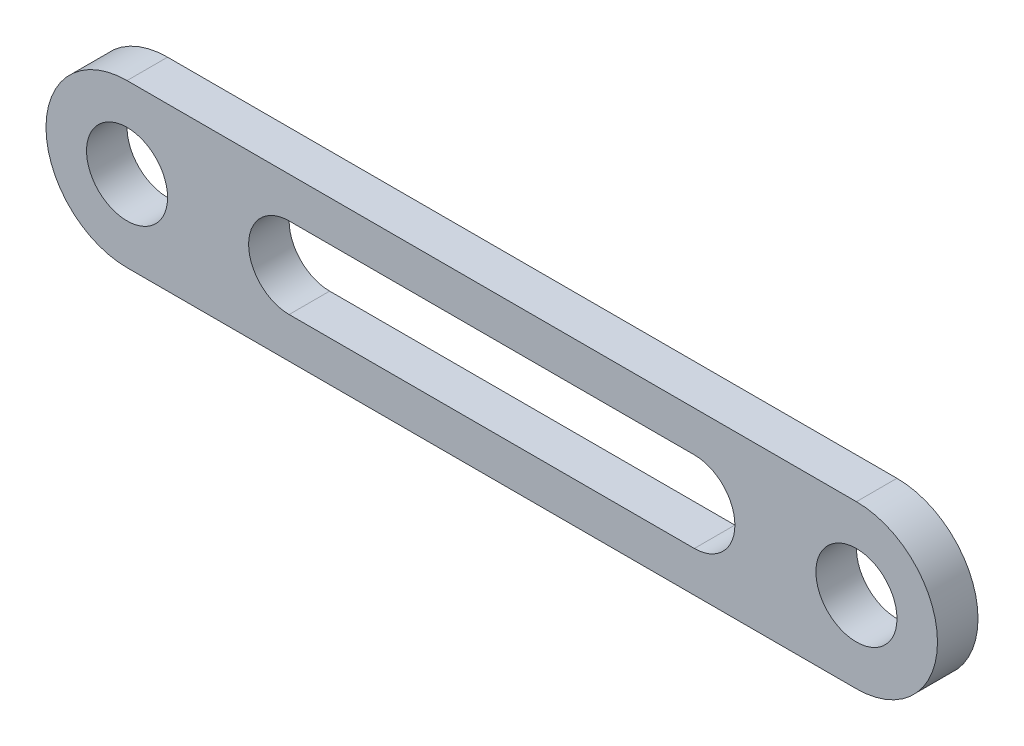
ISO-10303-21;
HEADER;
FILE_DESCRIPTION(('STEP AP214'),'2;1');
FILE_NAME('part.step','',(''),(''),'','','');
FILE_SCHEMA(('AUTOMOTIVE_DESIGN { 1 0 10303 214 1 1 1 1 }'));
ENDSEC;
DATA;
#1=APPLICATION_CONTEXT('core data for automotive mechanical design processes');
#2=APPLICATION_PROTOCOL_DEFINITION('international standard','automotive_design',2000,#1);
#3=PRODUCT_CONTEXT('',#1,'mechanical');
#4=PRODUCT('Part','Part','',(#3));
#5=PRODUCT_RELATED_PRODUCT_CATEGORY('part','',(#4));
#6=PRODUCT_DEFINITION_FORMATION('','',#4);
#7=PRODUCT_DEFINITION_CONTEXT('part definition',#1,'design');
#8=PRODUCT_DEFINITION('design','',#6,#7);
#9=PRODUCT_DEFINITION_SHAPE('','',#8);
#10=(LENGTH_UNIT() NAMED_UNIT(*) SI_UNIT(.MILLI.,.METRE.));
#11=(NAMED_UNIT(*) PLANE_ANGLE_UNIT() SI_UNIT($,.RADIAN.));
#12=(NAMED_UNIT(*) SI_UNIT($,.STERADIAN.) SOLID_ANGLE_UNIT());
#13=UNCERTAINTY_MEASURE_WITH_UNIT(LENGTH_MEASURE(1.E-05),#10,'distance_accuracy_value','');
#14=(GEOMETRIC_REPRESENTATION_CONTEXT(3) GLOBAL_UNCERTAINTY_ASSIGNED_CONTEXT((#13)) GLOBAL_UNIT_ASSIGNED_CONTEXT((#10,
#11,#12)) REPRESENTATION_CONTEXT('',''));
#15=CARTESIAN_POINT('',(0.,0.,0.));
#16=DIRECTION('',(0.,0.,1.));
#17=DIRECTION('',(1.,0.,0.));
#18=AXIS2_PLACEMENT_3D('',#15,#16,#17);
#19=CARTESIAN_POINT('',(0.,9.99999999999999,5.));
#20=DIRECTION('',(0.,1.,0.));
#21=DIRECTION('',(0.,0.,1.));
#22=AXIS2_PLACEMENT_3D('',#19,#20,#21);
#23=PLANE('',#22);
#24=DIRECTION('',(1.,0.,0.));
#25=VECTOR('',#24,1.);
#26=CARTESIAN_POINT('',(0.,9.99999999999999,0.));
#27=LINE('',#26,#25);
#28=CARTESIAN_POINT('',(-90.,9.99999999999999,0.));
#29=VERTEX_POINT('',#28);
#30=CARTESIAN_POINT('',(0.,9.99999999999999,0.));
#31=VERTEX_POINT('',#30);
#32=EDGE_CURVE('E148',#29,#31,#27,.T.);
#33=ORIENTED_EDGE('',*,*,#32,.F.);
#34=DIRECTION('',(0.,0.,-1.));
#35=VECTOR('',#34,1.);
#36=CARTESIAN_POINT('',(-90.,9.99999999999999,5.));
#37=LINE('',#36,#35);
#38=CARTESIAN_POINT('',(-90.,9.99999999999999,5.));
#39=VERTEX_POINT('',#38);
#40=EDGE_CURVE('E11',#39,#29,#37,.T.);
#41=ORIENTED_EDGE('',*,*,#40,.F.);
#42=DIRECTION('',(1.,0.,0.));
#43=VECTOR('',#42,1.);
#44=CARTESIAN_POINT('',(0.,9.99999999999999,5.));
#45=LINE('',#44,#43);
#46=CARTESIAN_POINT('',(0.,9.99999999999999,5.));
#47=VERTEX_POINT('',#46);
#48=EDGE_CURVE('E122',#39,#47,#45,.T.);
#49=ORIENTED_EDGE('',*,*,#48,.T.);
#50=DIRECTION('',(0.,0.,-1.));
#51=VECTOR('',#50,1.);
#52=CARTESIAN_POINT('',(0.,9.99999999999999,5.));
#53=LINE('',#52,#51);
#54=EDGE_CURVE('E88',#47,#31,#53,.T.);
#55=ORIENTED_EDGE('',*,*,#54,.T.);
#56=EDGE_LOOP('',(#33,#41,#49,#55));
#57=FACE_BOUND('',#56,.T.);
#58=ADVANCED_FACE('F35',(#57),#23,.T.);
#59=CARTESIAN_POINT('',(-90.,0.,5.));
#60=DIRECTION('',(0.,0.,-1.));
#61=DIRECTION('',(-1.,0.,0.));
#62=AXIS2_PLACEMENT_3D('',#59,#60,#61);
#63=CYLINDRICAL_SURFACE('',#62,10.);
#64=CARTESIAN_POINT('',(-90.,0.,0.));
#65=DIRECTION('',(0.,0.,1.));
#66=DIRECTION('',(1.,0.,0.));
#67=AXIS2_PLACEMENT_3D('',#64,#65,#66);
#68=CIRCLE('',#67,10.);
#69=CARTESIAN_POINT('',(-90.,-10.,0.));
#70=VERTEX_POINT('',#69);
#71=EDGE_CURVE('E127',#29,#70,#68,.T.);
#72=ORIENTED_EDGE('',*,*,#71,.T.);
#73=DIRECTION('',(0.,0.,-1.));
#74=VECTOR('',#73,1.);
#75=CARTESIAN_POINT('',(-90.,-10.,5.));
#76=LINE('',#75,#74);
#77=CARTESIAN_POINT('',(-90.,-10.,5.));
#78=VERTEX_POINT('',#77);
#79=EDGE_CURVE('E45',#78,#70,#76,.T.);
#80=ORIENTED_EDGE('',*,*,#79,.F.);
#81=CARTESIAN_POINT('',(-90.,0.,5.));
#82=DIRECTION('',(0.,0.,1.));
#83=DIRECTION('',(1.,0.,0.));
#84=AXIS2_PLACEMENT_3D('',#81,#82,#83);
#85=CIRCLE('',#84,10.);
#86=EDGE_CURVE('E118',#39,#78,#85,.T.);
#87=ORIENTED_EDGE('',*,*,#86,.F.);
#88=ORIENTED_EDGE('',*,*,#40,.T.);
#89=EDGE_LOOP('',(#72,#80,#87,#88));
#90=FACE_BOUND('',#89,.T.);
#91=ADVANCED_FACE('F125',(#90),#63,.T.);
#92=CARTESIAN_POINT('',(0.,-10.,5.));
#93=DIRECTION('',(0.,1.,0.));
#94=DIRECTION('',(0.,0.,1.));
#95=AXIS2_PLACEMENT_3D('',#92,#93,#94);
#96=PLANE('',#95);
#97=DIRECTION('',(1.,0.,0.));
#98=VECTOR('',#97,1.);
#99=CARTESIAN_POINT('',(0.,-10.,0.));
#100=LINE('',#99,#98);
#101=CARTESIAN_POINT('',(0.,-10.,0.));
#102=VERTEX_POINT('',#101);
#103=EDGE_CURVE('E145',#70,#102,#100,.T.);
#104=ORIENTED_EDGE('',*,*,#103,.T.);
#105=DIRECTION('',(0.,0.,-1.));
#106=VECTOR('',#105,1.);
#107=CARTESIAN_POINT('',(0.,-10.,5.));
#108=LINE('',#107,#106);
#109=CARTESIAN_POINT('',(0.,-10.,5.));
#110=VERTEX_POINT('',#109);
#111=EDGE_CURVE('E117',#110,#102,#108,.T.);
#112=ORIENTED_EDGE('',*,*,#111,.F.);
#113=DIRECTION('',(1.,0.,0.));
#114=VECTOR('',#113,1.);
#115=CARTESIAN_POINT('',(0.,-10.,5.));
#116=LINE('',#115,#114);
#117=EDGE_CURVE('E111',#78,#110,#116,.T.);
#118=ORIENTED_EDGE('',*,*,#117,.F.);
#119=ORIENTED_EDGE('',*,*,#79,.T.);
#120=EDGE_LOOP('',(#104,#112,#118,#119));
#121=FACE_BOUND('',#120,.T.);
#122=ADVANCED_FACE('F114',(#121),#96,.F.);
#123=CARTESIAN_POINT('',(-20.,0.,5.));
#124=DIRECTION('',(0.,0.,-1.));
#125=DIRECTION('',(-1.,0.,0.));
#126=AXIS2_PLACEMENT_3D('',#123,#124,#125);
#127=CYLINDRICAL_SURFACE('',#126,4.99999999999999);
#128=CARTESIAN_POINT('',(-20.,0.,0.));
#129=DIRECTION('',(0.,0.,1.));
#130=DIRECTION('',(1.,0.,0.));
#131=AXIS2_PLACEMENT_3D('',#128,#129,#130);
#132=CIRCLE('',#131,4.99999999999999);
#133=CARTESIAN_POINT('',(-20.,-4.99999999999999,0.));
#134=VERTEX_POINT('',#133);
#135=CARTESIAN_POINT('',(-20.,4.99999999999999,0.));
#136=VERTEX_POINT('',#135);
#137=EDGE_CURVE('E165',#134,#136,#132,.T.);
#138=ORIENTED_EDGE('',*,*,#137,.F.);
#139=DIRECTION('',(0.,0.,-1.));
#140=VECTOR('',#139,1.);
#141=CARTESIAN_POINT('',(-20.,-4.99999999999999,5.));
#142=LINE('',#141,#140);
#143=CARTESIAN_POINT('',(-20.,-4.99999999999999,5.));
#144=VERTEX_POINT('',#143);
#145=EDGE_CURVE('E39',#144,#134,#142,.T.);
#146=ORIENTED_EDGE('',*,*,#145,.F.);
#147=CARTESIAN_POINT('',(-20.,0.,5.));
#148=DIRECTION('',(0.,0.,1.));
#149=DIRECTION('',(1.,0.,0.));
#150=AXIS2_PLACEMENT_3D('',#147,#148,#149);
#151=CIRCLE('',#150,4.99999999999999);
#152=CARTESIAN_POINT('',(-20.,4.99999999999999,5.));
#153=VERTEX_POINT('',#152);
#154=EDGE_CURVE('E144',#144,#153,#151,.T.);
#155=ORIENTED_EDGE('',*,*,#154,.T.);
#156=DIRECTION('',(0.,0.,-1.));
#157=VECTOR('',#156,1.);
#158=CARTESIAN_POINT('',(-20.,4.99999999999999,5.));
#159=LINE('',#158,#157);
#160=EDGE_CURVE('E132',#153,#136,#159,.T.);
#161=ORIENTED_EDGE('',*,*,#160,.T.);
#162=EDGE_LOOP('',(#138,#146,#155,#161));
#163=FACE_BOUND('',#162,.T.);
#164=ADVANCED_FACE('F37',(#163),#127,.F.);
#165=CARTESIAN_POINT('',(0.,-4.99999999999999,5.));
#166=DIRECTION('',(0.,1.,0.));
#167=DIRECTION('',(0.,0.,1.));
#168=AXIS2_PLACEMENT_3D('',#165,#166,#167);
#169=PLANE('',#168);
#170=DIRECTION('',(1.,0.,0.));
#171=VECTOR('',#170,1.);
#172=CARTESIAN_POINT('',(0.,-4.99999999999999,0.));
#173=LINE('',#172,#171);
#174=CARTESIAN_POINT('',(-70.,-4.99999999999999,0.));
#175=VERTEX_POINT('',#174);
#176=EDGE_CURVE('E162',#175,#134,#173,.T.);
#177=ORIENTED_EDGE('',*,*,#176,.F.);
#178=DIRECTION('',(0.,0.,-1.));
#179=VECTOR('',#178,1.);
#180=CARTESIAN_POINT('',(-70.,-4.99999999999999,5.));
#181=LINE('',#180,#179);
#182=CARTESIAN_POINT('',(-70.,-4.99999999999999,5.));
#183=VERTEX_POINT('',#182);
#184=EDGE_CURVE('E135',#183,#175,#181,.T.);
#185=ORIENTED_EDGE('',*,*,#184,.F.);
#186=DIRECTION('',(1.,0.,0.));
#187=VECTOR('',#186,1.);
#188=CARTESIAN_POINT('',(0.,-4.99999999999999,5.));
#189=LINE('',#188,#187);
#190=EDGE_CURVE('E180',#183,#144,#189,.T.);
#191=ORIENTED_EDGE('',*,*,#190,.T.);
#192=ORIENTED_EDGE('',*,*,#145,.T.);
#193=EDGE_LOOP('',(#177,#185,#191,#192));
#194=FACE_BOUND('',#193,.T.);
#195=ADVANCED_FACE('F188',(#194),#169,.T.);
#196=CARTESIAN_POINT('',(-70.,0.,5.));
#197=DIRECTION('',(0.,0.,-1.));
#198=DIRECTION('',(-1.,0.,0.));
#199=AXIS2_PLACEMENT_3D('',#196,#197,#198);
#200=CYLINDRICAL_SURFACE('',#199,4.99999999999999);
#201=CARTESIAN_POINT('',(-70.,0.,0.));
#202=DIRECTION('',(0.,0.,1.));
#203=DIRECTION('',(1.,0.,0.));
#204=AXIS2_PLACEMENT_3D('',#201,#202,#203);
#205=CIRCLE('',#204,4.99999999999999);
#206=CARTESIAN_POINT('',(-70.,4.99999999999999,0.));
#207=VERTEX_POINT('',#206);
#208=EDGE_CURVE('E159',#207,#175,#205,.T.);
#209=ORIENTED_EDGE('',*,*,#208,.F.);
#210=DIRECTION('',(0.,0.,-1.));
#211=VECTOR('',#210,1.);
#212=CARTESIAN_POINT('',(-70.,4.99999999999999,5.));
#213=LINE('',#212,#211);
#214=CARTESIAN_POINT('',(-70.,4.99999999999999,5.));
#215=VERTEX_POINT('',#214);
#216=EDGE_CURVE('E134',#215,#207,#213,.T.);
#217=ORIENTED_EDGE('',*,*,#216,.F.);
#218=CARTESIAN_POINT('',(-70.,0.,5.));
#219=DIRECTION('',(0.,0.,1.));
#220=DIRECTION('',(1.,0.,0.));
#221=AXIS2_PLACEMENT_3D('',#218,#219,#220);
#222=CIRCLE('',#221,4.99999999999999);
#223=EDGE_CURVE('E178',#215,#183,#222,.T.);
#224=ORIENTED_EDGE('',*,*,#223,.T.);
#225=ORIENTED_EDGE('',*,*,#184,.T.);
#226=EDGE_LOOP('',(#209,#217,#224,#225));
#227=FACE_BOUND('',#226,.T.);
#228=ADVANCED_FACE('F193',(#227),#200,.F.);
#229=CARTESIAN_POINT('',(-90.,0.,5.));
#230=DIRECTION('',(0.,0.,-1.));
#231=DIRECTION('',(-1.,0.,0.));
#232=AXIS2_PLACEMENT_3D('',#229,#230,#231);
#233=CYLINDRICAL_SURFACE('',#232,4.99999999999999);
#234=CARTESIAN_POINT('',(-90.,0.,5.));
#235=DIRECTION('',(0.,0.,1.));
#236=DIRECTION('',(1.,0.,0.));
#237=AXIS2_PLACEMENT_3D('',#234,#235,#236);
#238=CIRCLE('',#237,4.99999999999999);
#239=CARTESIAN_POINT('',(-85.,0.,5.));
#240=VERTEX_POINT('',#239);
#241=EDGE_CURVE('E170',#240,#240,#238,.T.);
#242=ORIENTED_EDGE('',*,*,#241,.T.);
#243=EDGE_LOOP('',(#242));
#244=FACE_BOUND('',#243,.T.);
#245=CARTESIAN_POINT('',(-90.,0.,0.));
#246=DIRECTION('',(0.,0.,1.));
#247=DIRECTION('',(1.,0.,0.));
#248=AXIS2_PLACEMENT_3D('',#245,#246,#247);
#249=CIRCLE('',#248,4.99999999999999);
#250=CARTESIAN_POINT('',(-85.,0.,0.));
#251=VERTEX_POINT('',#250);
#252=EDGE_CURVE('E150',#251,#251,#249,.T.);
#253=ORIENTED_EDGE('',*,*,#252,.F.);
#254=EDGE_LOOP('',(#253));
#255=FACE_BOUND('',#254,.T.);
#256=ADVANCED_FACE('F206',(#244,#255),#233,.F.);
#257=CARTESIAN_POINT('',(0.,0.,5.));
#258=DIRECTION('',(0.,0.,-1.));
#259=DIRECTION('',(-1.,0.,0.));
#260=AXIS2_PLACEMENT_3D('',#257,#258,#259);
#261=CYLINDRICAL_SURFACE('',#260,4.99999999999999);
#262=CARTESIAN_POINT('',(0.,0.,5.));
#263=DIRECTION('',(0.,0.,1.));
#264=DIRECTION('',(1.,0.,0.));
#265=AXIS2_PLACEMENT_3D('',#262,#263,#264);
#266=CIRCLE('',#265,4.99999999999999);
#267=CARTESIAN_POINT('',(4.99999999999999,0.,5.));
#268=VERTEX_POINT('',#267);
#269=EDGE_CURVE('E173',#268,#268,#266,.T.);
#270=ORIENTED_EDGE('',*,*,#269,.T.);
#271=EDGE_LOOP('',(#270));
#272=FACE_BOUND('',#271,.T.);
#273=CARTESIAN_POINT('',(0.,0.,0.));
#274=DIRECTION('',(0.,0.,1.));
#275=DIRECTION('',(1.,0.,0.));
#276=AXIS2_PLACEMENT_3D('',#273,#274,#275);
#277=CIRCLE('',#276,4.99999999999999);
#278=CARTESIAN_POINT('',(4.99999999999999,0.,0.));
#279=VERTEX_POINT('',#278);
#280=EDGE_CURVE('E153',#279,#279,#277,.T.);
#281=ORIENTED_EDGE('',*,*,#280,.F.);
#282=EDGE_LOOP('',(#281));
#283=FACE_BOUND('',#282,.T.);
#284=ADVANCED_FACE('F198',(#272,#283),#261,.F.);
#285=CARTESIAN_POINT('',(0.,4.99999999999999,5.));
#286=DIRECTION('',(0.,1.,0.));
#287=DIRECTION('',(0.,0.,1.));
#288=AXIS2_PLACEMENT_3D('',#285,#286,#287);
#289=PLANE('',#288);
#290=DIRECTION('',(1.,0.,0.));
#291=VECTOR('',#290,1.);
#292=CARTESIAN_POINT('',(0.,4.99999999999999,0.));
#293=LINE('',#292,#291);
#294=EDGE_CURVE('E156',#207,#136,#293,.T.);
#295=ORIENTED_EDGE('',*,*,#294,.T.);
#296=ORIENTED_EDGE('',*,*,#160,.F.);
#297=DIRECTION('',(1.,0.,0.));
#298=VECTOR('',#297,1.);
#299=CARTESIAN_POINT('',(0.,4.99999999999999,5.));
#300=LINE('',#299,#298);
#301=EDGE_CURVE('E176',#215,#153,#300,.T.);
#302=ORIENTED_EDGE('',*,*,#301,.F.);
#303=ORIENTED_EDGE('',*,*,#216,.T.);
#304=EDGE_LOOP('',(#295,#296,#302,#303));
#305=FACE_BOUND('',#304,.T.);
#306=ADVANCED_FACE('F195',(#305),#289,.F.);
#307=CARTESIAN_POINT('',(0.,0.,5.));
#308=DIRECTION('',(0.,0.,-1.));
#309=DIRECTION('',(-1.,0.,0.));
#310=AXIS2_PLACEMENT_3D('',#307,#308,#309);
#311=CYLINDRICAL_SURFACE('',#310,10.);
#312=CARTESIAN_POINT('',(0.,0.,0.));
#313=DIRECTION('',(0.,0.,1.));
#314=DIRECTION('',(1.,0.,0.));
#315=AXIS2_PLACEMENT_3D('',#312,#313,#314);
#316=CIRCLE('',#315,10.);
#317=EDGE_CURVE('E81',#102,#31,#316,.T.);
#318=ORIENTED_EDGE('',*,*,#317,.T.);
#319=ORIENTED_EDGE('',*,*,#54,.F.);
#320=CARTESIAN_POINT('',(0.,0.,5.));
#321=DIRECTION('',(0.,0.,1.));
#322=DIRECTION('',(1.,0.,0.));
#323=AXIS2_PLACEMENT_3D('',#320,#321,#322);
#324=CIRCLE('',#323,10.);
#325=EDGE_CURVE('E54',#110,#47,#324,.T.);
#326=ORIENTED_EDGE('',*,*,#325,.F.);
#327=ORIENTED_EDGE('',*,*,#111,.T.);
#328=EDGE_LOOP('',(#318,#319,#326,#327));
#329=FACE_BOUND('',#328,.T.);
#330=ADVANCED_FACE('F197',(#329),#311,.T.);
#331=CARTESIAN_POINT('',(0.,0.,5.));
#332=DIRECTION('',(0.,0.,1.));
#333=DIRECTION('',(1.,0.,0.));
#334=AXIS2_PLACEMENT_3D('',#331,#332,#333);
#335=PLANE('',#334);
#336=ORIENTED_EDGE('',*,*,#154,.F.);
#337=ORIENTED_EDGE('',*,*,#190,.F.);
#338=ORIENTED_EDGE('',*,*,#223,.F.);
#339=ORIENTED_EDGE('',*,*,#301,.T.);
#340=EDGE_LOOP('',(#336,#337,#338,#339));
#341=FACE_BOUND('',#340,.T.);
#342=ORIENTED_EDGE('',*,*,#269,.F.);
#343=EDGE_LOOP('',(#342));
#344=FACE_BOUND('',#343,.T.);
#345=ORIENTED_EDGE('',*,*,#241,.F.);
#346=EDGE_LOOP('',(#345));
#347=FACE_BOUND('',#346,.T.);
#348=ORIENTED_EDGE('',*,*,#48,.F.);
#349=ORIENTED_EDGE('',*,*,#86,.T.);
#350=ORIENTED_EDGE('',*,*,#117,.T.);
#351=ORIENTED_EDGE('',*,*,#325,.T.);
#352=EDGE_LOOP('',(#348,#349,#350,#351));
#353=FACE_BOUND('',#352,.T.);
#354=ADVANCED_FACE('F121',(#341,#344,#347,#353),#335,.T.);
#355=CARTESIAN_POINT('',(0.,0.,0.));
#356=DIRECTION('',(0.,0.,1.));
#357=DIRECTION('',(1.,0.,0.));
#358=AXIS2_PLACEMENT_3D('',#355,#356,#357);
#359=PLANE('',#358);
#360=ORIENTED_EDGE('',*,*,#137,.T.);
#361=ORIENTED_EDGE('',*,*,#294,.F.);
#362=ORIENTED_EDGE('',*,*,#208,.T.);
#363=ORIENTED_EDGE('',*,*,#176,.T.);
#364=EDGE_LOOP('',(#360,#361,#362,#363));
#365=FACE_BOUND('',#364,.T.);
#366=ORIENTED_EDGE('',*,*,#280,.T.);
#367=EDGE_LOOP('',(#366));
#368=FACE_BOUND('',#367,.T.);
#369=ORIENTED_EDGE('',*,*,#252,.T.);
#370=EDGE_LOOP('',(#369));
#371=FACE_BOUND('',#370,.T.);
#372=ORIENTED_EDGE('',*,*,#32,.T.);
#373=ORIENTED_EDGE('',*,*,#317,.F.);
#374=ORIENTED_EDGE('',*,*,#103,.F.);
#375=ORIENTED_EDGE('',*,*,#71,.F.);
#376=EDGE_LOOP('',(#372,#373,#374,#375));
#377=FACE_BOUND('',#376,.T.);
#378=ADVANCED_FACE('F191',(#365,#368,#371,#377),#359,.F.);
#379=CLOSED_SHELL('',(#58,#91,#122,#164,#195,#228,#256,#284,#306,#330,#354,#378));
#380=MANIFOLD_SOLID_BREP('B2',#379);
#381=ADVANCED_BREP_SHAPE_REPRESENTATION('',(#18,#380),#14);
#382=SHAPE_DEFINITION_REPRESENTATION(#9,#381);
ENDSEC;
END-ISO-10303-21;
